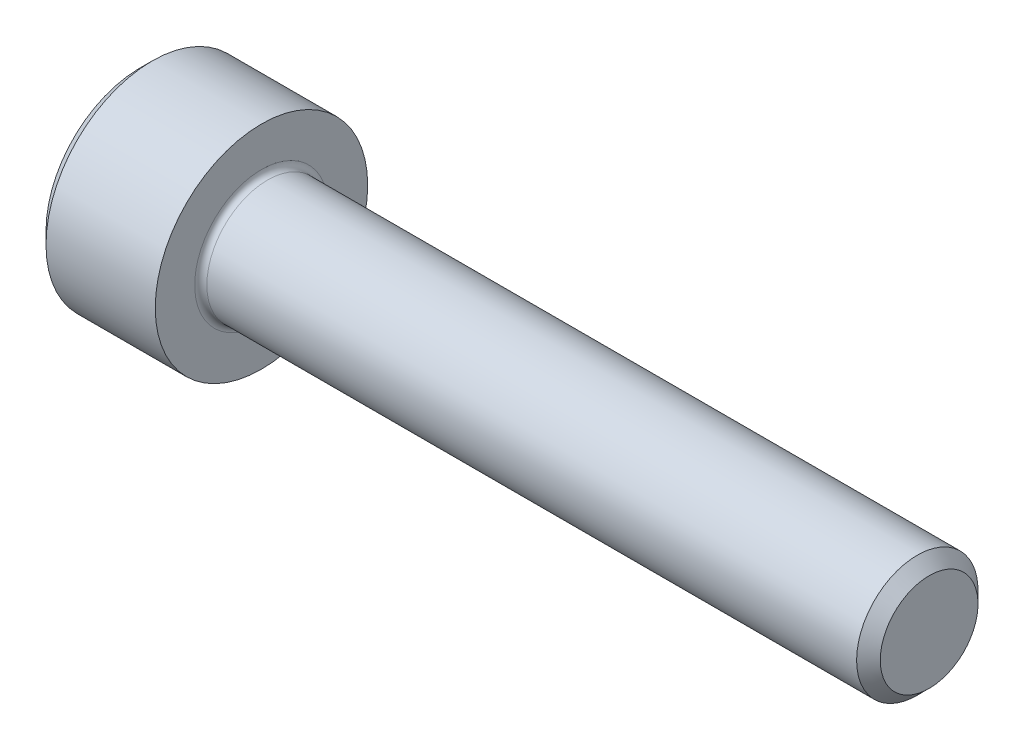
ISO-10303-21;
HEADER;
FILE_DESCRIPTION(('STEP AP214'),'2;1');
FILE_NAME('part.step','',(''),(''),'','','');
FILE_SCHEMA(('AUTOMOTIVE_DESIGN { 1 0 10303 214 1 1 1 1 }'));
ENDSEC;
DATA;
#1=APPLICATION_CONTEXT('core data for automotive mechanical design processes');
#2=APPLICATION_PROTOCOL_DEFINITION('international standard','automotive_design',2000,#1);
#3=PRODUCT_CONTEXT('',#1,'mechanical');
#4=PRODUCT('Part','Part','',(#3));
#5=PRODUCT_RELATED_PRODUCT_CATEGORY('part','',(#4));
#6=PRODUCT_DEFINITION_FORMATION('','',#4);
#7=PRODUCT_DEFINITION_CONTEXT('part definition',#1,'design');
#8=PRODUCT_DEFINITION('design','',#6,#7);
#9=PRODUCT_DEFINITION_SHAPE('','',#8);
#10=(LENGTH_UNIT() NAMED_UNIT(*) SI_UNIT(.MILLI.,.METRE.));
#11=(NAMED_UNIT(*) PLANE_ANGLE_UNIT() SI_UNIT($,.RADIAN.));
#12=(NAMED_UNIT(*) SI_UNIT($,.STERADIAN.) SOLID_ANGLE_UNIT());
#13=UNCERTAINTY_MEASURE_WITH_UNIT(LENGTH_MEASURE(1.E-05),#10,'distance_accuracy_value','');
#14=(GEOMETRIC_REPRESENTATION_CONTEXT(3) GLOBAL_UNCERTAINTY_ASSIGNED_CONTEXT((#13)) GLOBAL_UNIT_ASSIGNED_CONTEXT((#10,
#11,#12)) REPRESENTATION_CONTEXT('',''));
#15=CARTESIAN_POINT('',(0.,0.,0.));
#16=DIRECTION('',(0.,0.,1.));
#17=DIRECTION('',(1.,0.,0.));
#18=AXIS2_PLACEMENT_3D('',#15,#16,#17);
#19=CARTESIAN_POINT('',(0.,0.,0.));
#20=DIRECTION('',(-1.,0.,0.));
#21=DIRECTION('',(0.,0.,1.));
#22=AXIS2_PLACEMENT_3D('',#19,#20,#21);
#23=PLANE('',#22);
#24=DIRECTION('',(0.,-0.5,0.866025403784438));
#25=VECTOR('',#24,1.);
#26=CARTESIAN_POINT('',(0.,1.77304267668134,0.));
#27=LINE('',#26,#25);
#28=CARTESIAN_POINT('',(0.,1.77304267668134,0.));
#29=VERTEX_POINT('',#28);
#30=CARTESIAN_POINT('',(0.,0.886521338340668,1.5355));
#31=VERTEX_POINT('',#30);
#32=EDGE_CURVE('E261',#29,#31,#27,.T.);
#33=ORIENTED_EDGE('',*,*,#32,.T.);
#34=DIRECTION('',(0.,1.,0.));
#35=VECTOR('',#34,1.);
#36=CARTESIAN_POINT('',(0.,-0.886521338340674,1.5355));
#37=LINE('',#36,#35);
#38=CARTESIAN_POINT('',(0.,-0.886521338340674,1.5355));
#39=VERTEX_POINT('',#38);
#40=EDGE_CURVE('E132',#39,#31,#37,.T.);
#41=ORIENTED_EDGE('',*,*,#40,.F.);
#42=DIRECTION('',(0.,-0.500000000000001,-0.866025403784438));
#43=VECTOR('',#42,1.);
#44=CARTESIAN_POINT('',(0.,-0.886521338340674,1.5355));
#45=LINE('',#44,#43);
#46=CARTESIAN_POINT('',(0.,-1.77304267668135,0.));
#47=VERTEX_POINT('',#46);
#48=EDGE_CURVE('E264',#39,#47,#45,.T.);
#49=ORIENTED_EDGE('',*,*,#48,.T.);
#50=DIRECTION('',(0.,0.5,-0.866025403784439));
#51=VECTOR('',#50,1.);
#52=CARTESIAN_POINT('',(0.,-1.77304267668135,0.));
#53=LINE('',#52,#51);
#54=CARTESIAN_POINT('',(0.,-0.886521338340676,-1.5355));
#55=VERTEX_POINT('',#54);
#56=EDGE_CURVE('E267',#47,#55,#53,.T.);
#57=ORIENTED_EDGE('',*,*,#56,.T.);
#58=DIRECTION('',(0.,-1.,0.));
#59=VECTOR('',#58,1.);
#60=CARTESIAN_POINT('',(0.,0.886521338340666,-1.53550000000001));
#61=LINE('',#60,#59);
#62=CARTESIAN_POINT('',(0.,0.886521338340666,-1.53550000000001));
#63=VERTEX_POINT('',#62);
#64=EDGE_CURVE('E270',#63,#55,#61,.T.);
#65=ORIENTED_EDGE('',*,*,#64,.F.);
#66=DIRECTION('',(0.,-0.500000000000001,-0.866025403784438));
#67=VECTOR('',#66,1.);
#68=CARTESIAN_POINT('',(0.,1.77304267668134,0.));
#69=LINE('',#68,#67);
#70=EDGE_CURVE('E127',#29,#63,#69,.T.);
#71=ORIENTED_EDGE('',*,*,#70,.F.);
#72=EDGE_LOOP('',(#33,#41,#49,#57,#65,#71));
#73=FACE_BOUND('',#72,.T.);
#74=CARTESIAN_POINT('',(0.,0.,0.));
#75=DIRECTION('',(-1.,0.,0.));
#76=DIRECTION('',(0.,0.,1.));
#77=AXIS2_PLACEMENT_3D('',#74,#75,#76);
#78=CIRCLE('',#77,3.1);
#79=CARTESIAN_POINT('',(0.,0.,3.1));
#80=VERTEX_POINT('',#79);
#81=EDGE_CURVE('E156',#80,#80,#78,.T.);
#82=ORIENTED_EDGE('',*,*,#81,.T.);
#83=EDGE_LOOP('',(#82));
#84=FACE_BOUND('',#83,.T.);
#85=ADVANCED_FACE('F36',(#73,#84),#23,.T.);
#86=CARTESIAN_POINT('',(0.,0.,0.));
#87=DIRECTION('',(1.,0.,0.));
#88=DIRECTION('',(0.,0.,-1.));
#89=AXIS2_PLACEMENT_3D('',#86,#87,#88);
#90=CONICAL_SURFACE('',#89,3.1,0.785398163397452);
#91=CARTESIAN_POINT('',(0.399999999999998,0.,0.));
#92=DIRECTION('',(-1.,0.,0.));
#93=DIRECTION('',(0.,0.,1.));
#94=AXIS2_PLACEMENT_3D('',#91,#92,#93);
#95=CIRCLE('',#94,3.5);
#96=CARTESIAN_POINT('',(0.399999999999998,0.,3.5));
#97=VERTEX_POINT('',#96);
#98=EDGE_CURVE('E153',#97,#97,#95,.T.);
#99=ORIENTED_EDGE('',*,*,#98,.T.);
#100=EDGE_LOOP('',(#99));
#101=FACE_BOUND('',#100,.T.);
#102=ORIENTED_EDGE('',*,*,#81,.F.);
#103=EDGE_LOOP('',(#102));
#104=FACE_BOUND('',#103,.T.);
#105=ADVANCED_FACE('F177',(#101,#104),#90,.T.);
#106=CARTESIAN_POINT('',(-31.75,0.,0.));
#107=DIRECTION('',(-1.,0.,0.));
#108=DIRECTION('',(0.,0.,1.));
#109=AXIS2_PLACEMENT_3D('',#106,#107,#108);
#110=CYLINDRICAL_SURFACE('',#109,3.5);
#111=CARTESIAN_POINT('',(4.,0.,0.));
#112=DIRECTION('',(-1.,0.,0.));
#113=DIRECTION('',(0.,0.,1.));
#114=AXIS2_PLACEMENT_3D('',#111,#112,#113);
#115=CIRCLE('',#114,3.5);
#116=CARTESIAN_POINT('',(4.,0.,3.5));
#117=VERTEX_POINT('',#116);
#118=EDGE_CURVE('E150',#117,#117,#115,.T.);
#119=ORIENTED_EDGE('',*,*,#118,.T.);
#120=EDGE_LOOP('',(#119));
#121=FACE_BOUND('',#120,.T.);
#122=ORIENTED_EDGE('',*,*,#98,.F.);
#123=EDGE_LOOP('',(#122));
#124=FACE_BOUND('',#123,.T.);
#125=ADVANCED_FACE('F182',(#121,#124),#110,.T.);
#126=CARTESIAN_POINT('',(4.,3.5,0.));
#127=DIRECTION('',(1.,0.,0.));
#128=DIRECTION('',(0.,0.,-1.));
#129=AXIS2_PLACEMENT_3D('',#126,#127,#128);
#130=PLANE('',#129);
#131=CARTESIAN_POINT('',(4.,0.,0.));
#132=DIRECTION('',(1.,0.,0.));
#133=DIRECTION('',(0.,0.,-1.));
#134=AXIS2_PLACEMENT_3D('',#131,#132,#133);
#135=CIRCLE('',#134,2.19999999999997);
#136=CARTESIAN_POINT('',(4.,0.,-2.19999999999997));
#137=VERTEX_POINT('',#136);
#138=EDGE_CURVE('E44',#137,#137,#135,.F.);
#139=ORIENTED_EDGE('',*,*,#138,.T.);
#140=EDGE_LOOP('',(#139));
#141=FACE_BOUND('',#140,.T.);
#142=ORIENTED_EDGE('',*,*,#118,.F.);
#143=EDGE_LOOP('',(#142));
#144=FACE_BOUND('',#143,.T.);
#145=ADVANCED_FACE('F161',(#141,#144),#130,.T.);
#146=CARTESIAN_POINT('',(-31.75,0.,0.));
#147=DIRECTION('',(-1.,0.,0.));
#148=DIRECTION('',(0.,0.,1.));
#149=AXIS2_PLACEMENT_3D('',#146,#147,#148);
#150=CYLINDRICAL_SURFACE('',#149,1.99999999999997);
#151=CARTESIAN_POINT('',(4.2,0.,0.));
#152=DIRECTION('',(1.,0.,0.));
#153=DIRECTION('',(0.,0.,-1.));
#154=AXIS2_PLACEMENT_3D('',#151,#152,#153);
#155=CIRCLE('',#154,1.99999999999997);
#156=CARTESIAN_POINT('',(4.2,0.,-1.99999999999997));
#157=VERTEX_POINT('',#156);
#158=EDGE_CURVE('E11',#157,#157,#155,.T.);
#159=ORIENTED_EDGE('',*,*,#158,.T.);
#160=EDGE_LOOP('',(#159));
#161=FACE_BOUND('',#160,.T.);
#162=CARTESIAN_POINT('',(25.6099999999999,0.,0.));
#163=DIRECTION('',(-1.,0.,0.));
#164=DIRECTION('',(0.,0.,1.));
#165=AXIS2_PLACEMENT_3D('',#162,#163,#164);
#166=CIRCLE('',#165,1.99999999999993);
#167=CARTESIAN_POINT('',(25.6099999999999,0.,1.99999999999993));
#168=VERTEX_POINT('',#167);
#169=EDGE_CURVE('E147',#168,#168,#166,.T.);
#170=ORIENTED_EDGE('',*,*,#169,.T.);
#171=EDGE_LOOP('',(#170));
#172=FACE_BOUND('',#171,.T.);
#173=ADVANCED_FACE('F192',(#161,#172),#150,.T.);
#174=CARTESIAN_POINT('',(26.,0.,0.));
#175=DIRECTION('',(-1.,0.,0.));
#176=DIRECTION('',(0.,0.,1.));
#177=AXIS2_PLACEMENT_3D('',#174,#175,#176);
#178=CONICAL_SURFACE('',#177,1.61,0.785398163397281);
#179=ORIENTED_EDGE('',*,*,#169,.F.);
#180=EDGE_LOOP('',(#179));
#181=FACE_BOUND('',#180,.T.);
#182=CARTESIAN_POINT('',(26.,0.,0.));
#183=DIRECTION('',(-1.,0.,0.));
#184=DIRECTION('',(0.,0.,1.));
#185=AXIS2_PLACEMENT_3D('',#182,#183,#184);
#186=CIRCLE('',#185,1.61);
#187=CARTESIAN_POINT('',(26.,0.,1.61));
#188=VERTEX_POINT('',#187);
#189=EDGE_CURVE('E143',#188,#188,#186,.T.);
#190=ORIENTED_EDGE('',*,*,#189,.T.);
#191=EDGE_LOOP('',(#190));
#192=FACE_BOUND('',#191,.T.);
#193=ADVANCED_FACE('F172',(#181,#192),#178,.T.);
#194=CARTESIAN_POINT('',(26.,1.61,0.));
#195=DIRECTION('',(1.,0.,0.));
#196=DIRECTION('',(0.,0.,-1.));
#197=AXIS2_PLACEMENT_3D('',#194,#195,#196);
#198=PLANE('',#197);
#199=ORIENTED_EDGE('',*,*,#189,.F.);
#200=EDGE_LOOP('',(#199));
#201=FACE_BOUND('',#200,.T.);
#202=ADVANCED_FACE('F165',(#201),#198,.T.);
#203=CARTESIAN_POINT('',(4.2,0.,0.));
#204=DIRECTION('',(1.,0.,0.));
#205=DIRECTION('',(0.,0.,-1.));
#206=AXIS2_PLACEMENT_3D('',#203,#204,#205);
#207=TOROIDAL_SURFACE('',#206,2.19999999999997,0.2);
#208=ORIENTED_EDGE('',*,*,#158,.F.);
#209=EDGE_LOOP('',(#208));
#210=FACE_BOUND('',#209,.T.);
#211=ORIENTED_EDGE('',*,*,#138,.F.);
#212=EDGE_LOOP('',(#211));
#213=FACE_BOUND('',#212,.T.);
#214=ADVANCED_FACE('F38',(#210,#213),#207,.F.);
#215=CARTESIAN_POINT('',(2.,1.77304267668134,0.));
#216=DIRECTION('',(0.,-0.866025403784438,-0.5));
#217=DIRECTION('',(0.,0.5,-0.866025403784439));
#218=AXIS2_PLACEMENT_3D('',#215,#216,#217);
#219=PLANE('',#218);
#220=ORIENTED_EDGE('',*,*,#32,.F.);
#221=DIRECTION('',(-1.,0.,0.));
#222=VECTOR('',#221,1.);
#223=CARTESIAN_POINT('',(2.,1.77304267668134,0.));
#224=LINE('',#223,#222);
#225=CARTESIAN_POINT('',(2.,1.77304267668134,0.));
#226=VERTEX_POINT('',#225);
#227=EDGE_CURVE('E251',#226,#29,#224,.T.);
#228=ORIENTED_EDGE('',*,*,#227,.F.);
#229=DIRECTION('',(0.,-0.5,0.866025403784438));
#230=VECTOR('',#229,1.);
#231=CARTESIAN_POINT('',(2.,1.77304267668134,0.));
#232=LINE('',#231,#230);
#233=CARTESIAN_POINT('',(2.,1.329782007511,0.767749999999998));
#234=VERTEX_POINT('',#233);
#235=EDGE_CURVE('E119',#226,#234,#232,.T.);
#236=ORIENTED_EDGE('',*,*,#235,.T.);
#237=CARTESIAN_POINT('',(2.,0.886521338340668,1.5355));
#238=VERTEX_POINT('',#237);
#239=EDGE_CURVE('E110',#234,#238,#232,.T.);
#240=ORIENTED_EDGE('',*,*,#239,.T.);
#241=DIRECTION('',(-1.,0.,0.));
#242=VECTOR('',#241,1.);
#243=CARTESIAN_POINT('',(2.,0.886521338340668,1.5355));
#244=LINE('',#243,#242);
#245=EDGE_CURVE('E124',#238,#31,#244,.T.);
#246=ORIENTED_EDGE('',*,*,#245,.T.);
#247=EDGE_LOOP('',(#220,#228,#236,#240,#246));
#248=FACE_BOUND('',#247,.T.);
#249=ADVANCED_FACE('F123',(#248),#219,.T.);
#250=CARTESIAN_POINT('',(2.,-0.886521338340674,1.5355));
#251=DIRECTION('',(0.,0.,1.));
#252=DIRECTION('',(0.,-1.,0.));
#253=AXIS2_PLACEMENT_3D('',#250,#251,#252);
#254=PLANE('',#253);
#255=ORIENTED_EDGE('',*,*,#40,.T.);
#256=ORIENTED_EDGE('',*,*,#245,.F.);
#257=DIRECTION('',(0.,1.,0.));
#258=VECTOR('',#257,1.);
#259=CARTESIAN_POINT('',(2.,-0.886521338340674,1.5355));
#260=LINE('',#259,#258);
#261=CARTESIAN_POINT('',(2.,0.,1.5355));
#262=VERTEX_POINT('',#261);
#263=EDGE_CURVE('E107',#262,#238,#260,.T.);
#264=ORIENTED_EDGE('',*,*,#263,.F.);
#265=CARTESIAN_POINT('',(2.,-0.886521338340674,1.5355));
#266=VERTEX_POINT('',#265);
#267=EDGE_CURVE('E118',#266,#262,#260,.T.);
#268=ORIENTED_EDGE('',*,*,#267,.F.);
#269=DIRECTION('',(-1.,0.,0.));
#270=VECTOR('',#269,1.);
#271=CARTESIAN_POINT('',(2.,-0.886521338340674,1.5355));
#272=LINE('',#271,#270);
#273=EDGE_CURVE('E134',#266,#39,#272,.T.);
#274=ORIENTED_EDGE('',*,*,#273,.T.);
#275=EDGE_LOOP('',(#255,#256,#264,#268,#274));
#276=FACE_BOUND('',#275,.T.);
#277=ADVANCED_FACE('F129',(#276),#254,.F.);
#278=CARTESIAN_POINT('',(2.,-0.886521338340674,1.5355));
#279=DIRECTION('',(0.,0.866025403784438,-0.500000000000001));
#280=DIRECTION('',(0.,0.500000000000001,0.866025403784438));
#281=AXIS2_PLACEMENT_3D('',#278,#279,#280);
#282=PLANE('',#281);
#283=ORIENTED_EDGE('',*,*,#48,.F.);
#284=ORIENTED_EDGE('',*,*,#273,.F.);
#285=DIRECTION('',(0.,-0.500000000000001,-0.866025403784438));
#286=VECTOR('',#285,1.);
#287=CARTESIAN_POINT('',(2.,-0.886521338340674,1.5355));
#288=LINE('',#287,#286);
#289=CARTESIAN_POINT('',(2.,-1.32978200751101,0.767750000000003));
#290=VERTEX_POINT('',#289);
#291=EDGE_CURVE('E290',#266,#290,#288,.T.);
#292=ORIENTED_EDGE('',*,*,#291,.T.);
#293=CARTESIAN_POINT('',(2.,-1.77304267668135,0.));
#294=VERTEX_POINT('',#293);
#295=EDGE_CURVE('E279',#290,#294,#288,.T.);
#296=ORIENTED_EDGE('',*,*,#295,.T.);
#297=DIRECTION('',(-1.,0.,0.));
#298=VECTOR('',#297,1.);
#299=CARTESIAN_POINT('',(2.,-1.77304267668135,0.));
#300=LINE('',#299,#298);
#301=EDGE_CURVE('E139',#294,#47,#300,.T.);
#302=ORIENTED_EDGE('',*,*,#301,.T.);
#303=EDGE_LOOP('',(#283,#284,#292,#296,#302));
#304=FACE_BOUND('',#303,.T.);
#305=ADVANCED_FACE('F205',(#304),#282,.T.);
#306=CARTESIAN_POINT('',(2.,-1.77304267668135,0.));
#307=DIRECTION('',(0.,0.866025403784439,0.5));
#308=DIRECTION('',(0.,-0.5,0.866025403784439));
#309=AXIS2_PLACEMENT_3D('',#306,#307,#308);
#310=PLANE('',#309);
#311=ORIENTED_EDGE('',*,*,#56,.F.);
#312=ORIENTED_EDGE('',*,*,#301,.F.);
#313=DIRECTION('',(0.,0.5,-0.866025403784439));
#314=VECTOR('',#313,1.);
#315=CARTESIAN_POINT('',(2.,-1.77304267668135,0.));
#316=LINE('',#315,#314);
#317=CARTESIAN_POINT('',(2.,-1.32978200751101,-0.767750000000003));
#318=VERTEX_POINT('',#317);
#319=EDGE_CURVE('E257',#294,#318,#316,.T.);
#320=ORIENTED_EDGE('',*,*,#319,.T.);
#321=CARTESIAN_POINT('',(2.,-0.886521338340676,-1.5355));
#322=VERTEX_POINT('',#321);
#323=EDGE_CURVE('E289',#318,#322,#316,.T.);
#324=ORIENTED_EDGE('',*,*,#323,.T.);
#325=DIRECTION('',(-1.,0.,0.));
#326=VECTOR('',#325,1.);
#327=CARTESIAN_POINT('',(2.,-0.886521338340676,-1.5355));
#328=LINE('',#327,#326);
#329=EDGE_CURVE('E250',#322,#55,#328,.T.);
#330=ORIENTED_EDGE('',*,*,#329,.T.);
#331=EDGE_LOOP('',(#311,#312,#320,#324,#330));
#332=FACE_BOUND('',#331,.T.);
#333=ADVANCED_FACE('F208',(#332),#310,.T.);
#334=CARTESIAN_POINT('',(2.,0.886521338340666,-1.53550000000001));
#335=DIRECTION('',(0.,0.,-1.));
#336=DIRECTION('',(0.,1.,0.));
#337=AXIS2_PLACEMENT_3D('',#334,#335,#336);
#338=PLANE('',#337);
#339=ORIENTED_EDGE('',*,*,#64,.T.);
#340=ORIENTED_EDGE('',*,*,#329,.F.);
#341=DIRECTION('',(0.,-1.,0.));
#342=VECTOR('',#341,1.);
#343=CARTESIAN_POINT('',(2.,0.886521338340666,-1.53550000000001));
#344=LINE('',#343,#342);
#345=CARTESIAN_POINT('',(2.,0.,-1.5355));
#346=VERTEX_POINT('',#345);
#347=EDGE_CURVE('E254',#346,#322,#344,.T.);
#348=ORIENTED_EDGE('',*,*,#347,.F.);
#349=CARTESIAN_POINT('',(2.,0.886521338340666,-1.53550000000001));
#350=VERTEX_POINT('',#349);
#351=EDGE_CURVE('E51',#350,#346,#344,.T.);
#352=ORIENTED_EDGE('',*,*,#351,.F.);
#353=DIRECTION('',(-1.,0.,0.));
#354=VECTOR('',#353,1.);
#355=CARTESIAN_POINT('',(2.,0.886521338340666,-1.53550000000001));
#356=LINE('',#355,#354);
#357=EDGE_CURVE('E247',#350,#63,#356,.T.);
#358=ORIENTED_EDGE('',*,*,#357,.T.);
#359=EDGE_LOOP('',(#339,#340,#348,#352,#358));
#360=FACE_BOUND('',#359,.T.);
#361=ADVANCED_FACE('F212',(#360),#338,.F.);
#362=CARTESIAN_POINT('',(2.,1.77304267668134,0.));
#363=DIRECTION('',(0.,0.866025403784438,-0.500000000000001));
#364=DIRECTION('',(0.,0.500000000000001,0.866025403784438));
#365=AXIS2_PLACEMENT_3D('',#362,#363,#364);
#366=PLANE('',#365);
#367=ORIENTED_EDGE('',*,*,#70,.T.);
#368=ORIENTED_EDGE('',*,*,#357,.F.);
#369=DIRECTION('',(0.,-0.500000000000001,-0.866025403784438));
#370=VECTOR('',#369,1.);
#371=CARTESIAN_POINT('',(2.,1.77304267668134,0.));
#372=LINE('',#371,#370);
#373=CARTESIAN_POINT('',(2.,1.32978200751101,-0.767750000000002));
#374=VERTEX_POINT('',#373);
#375=EDGE_CURVE('E237',#374,#350,#372,.T.);
#376=ORIENTED_EDGE('',*,*,#375,.F.);
#377=EDGE_CURVE('E243',#226,#374,#372,.T.);
#378=ORIENTED_EDGE('',*,*,#377,.F.);
#379=ORIENTED_EDGE('',*,*,#227,.T.);
#380=EDGE_LOOP('',(#367,#368,#376,#378,#379));
#381=FACE_BOUND('',#380,.T.);
#382=ADVANCED_FACE('F216',(#381),#366,.F.);
#383=CARTESIAN_POINT('',(2.,1.77304267668134,0.));
#384=DIRECTION('',(1.,0.,0.));
#385=DIRECTION('',(0.,0.,-1.));
#386=AXIS2_PLACEMENT_3D('',#383,#384,#385);
#387=PLANE('',#386);
#388=ORIENTED_EDGE('',*,*,#347,.T.);
#389=ORIENTED_EDGE('',*,*,#323,.F.);
#390=CARTESIAN_POINT('',(2.,0.,0.));
#391=DIRECTION('',(-1.,0.,0.));
#392=DIRECTION('',(0.,0.,1.));
#393=AXIS2_PLACEMENT_3D('',#390,#391,#392);
#394=CIRCLE('',#393,1.5355);
#395=EDGE_CURVE('E285',#346,#318,#394,.T.);
#396=ORIENTED_EDGE('',*,*,#395,.F.);
#397=EDGE_LOOP('',(#388,#389,#396));
#398=FACE_BOUND('',#397,.T.);
#399=ADVANCED_FACE('F220',(#398),#387,.F.);
#400=ORIENTED_EDGE('',*,*,#319,.F.);
#401=ORIENTED_EDGE('',*,*,#295,.F.);
#402=EDGE_CURVE('E137',#318,#290,#394,.T.);
#403=ORIENTED_EDGE('',*,*,#402,.F.);
#404=EDGE_LOOP('',(#400,#401,#403));
#405=FACE_BOUND('',#404,.T.);
#406=ADVANCED_FACE('F223',(#405),#387,.F.);
#407=ORIENTED_EDGE('',*,*,#291,.F.);
#408=ORIENTED_EDGE('',*,*,#267,.T.);
#409=EDGE_CURVE('E133',#290,#262,#394,.T.);
#410=ORIENTED_EDGE('',*,*,#409,.F.);
#411=EDGE_LOOP('',(#407,#408,#410));
#412=FACE_BOUND('',#411,.T.);
#413=ADVANCED_FACE('F228',(#412),#387,.F.);
#414=ORIENTED_EDGE('',*,*,#263,.T.);
#415=ORIENTED_EDGE('',*,*,#239,.F.);
#416=EDGE_CURVE('E113',#262,#234,#394,.T.);
#417=ORIENTED_EDGE('',*,*,#416,.F.);
#418=EDGE_LOOP('',(#414,#415,#417));
#419=FACE_BOUND('',#418,.T.);
#420=ADVANCED_FACE('F109',(#419),#387,.F.);
#421=ORIENTED_EDGE('',*,*,#235,.F.);
#422=ORIENTED_EDGE('',*,*,#377,.T.);
#423=EDGE_CURVE('E144',#234,#374,#394,.T.);
#424=ORIENTED_EDGE('',*,*,#423,.F.);
#425=EDGE_LOOP('',(#421,#422,#424));
#426=FACE_BOUND('',#425,.T.);
#427=ADVANCED_FACE('F231',(#426),#387,.F.);
#428=ORIENTED_EDGE('',*,*,#375,.T.);
#429=ORIENTED_EDGE('',*,*,#351,.T.);
#430=EDGE_CURVE('E240',#374,#346,#394,.T.);
#431=ORIENTED_EDGE('',*,*,#430,.F.);
#432=EDGE_LOOP('',(#428,#429,#431));
#433=FACE_BOUND('',#432,.T.);
#434=ADVANCED_FACE('F201',(#433),#387,.F.);
#435=CARTESIAN_POINT('',(2.,0.,0.));
#436=DIRECTION('',(-1.,0.,0.));
#437=DIRECTION('',(0.,0.,1.));
#438=AXIS2_PLACEMENT_3D('',#435,#436,#437);
#439=CONICAL_SURFACE('',#438,1.5355,1.04719755119659);
#440=CARTESIAN_POINT('',(2.88652133834068,0.,0.));
#441=VERTEX_POINT('',#440);
#442=VERTEX_LOOP('',#441);
#443=FACE_BOUND('',#442,.T.);
#444=ORIENTED_EDGE('',*,*,#416,.T.);
#445=ORIENTED_EDGE('',*,*,#423,.T.);
#446=ORIENTED_EDGE('',*,*,#430,.T.);
#447=ORIENTED_EDGE('',*,*,#395,.T.);
#448=ORIENTED_EDGE('',*,*,#402,.T.);
#449=ORIENTED_EDGE('',*,*,#409,.T.);
#450=EDGE_LOOP('',(#444,#445,#446,#447,#448,#449));
#451=FACE_BOUND('',#450,.T.);
#452=ADVANCED_FACE('F199',(#443,#451),#439,.F.);
#453=CLOSED_SHELL('',(#85,#105,#125,#145,#173,#193,#202,#214,#249,#277,#305,#333,#361,#382,#399,
#406,#413,#420,#427,#434,#452));
#454=MANIFOLD_SOLID_BREP('B2',#453);
#455=ADVANCED_BREP_SHAPE_REPRESENTATION('',(#18,#454),#14);
#456=SHAPE_DEFINITION_REPRESENTATION(#9,#455);
ENDSEC;
END-ISO-10303-21;
